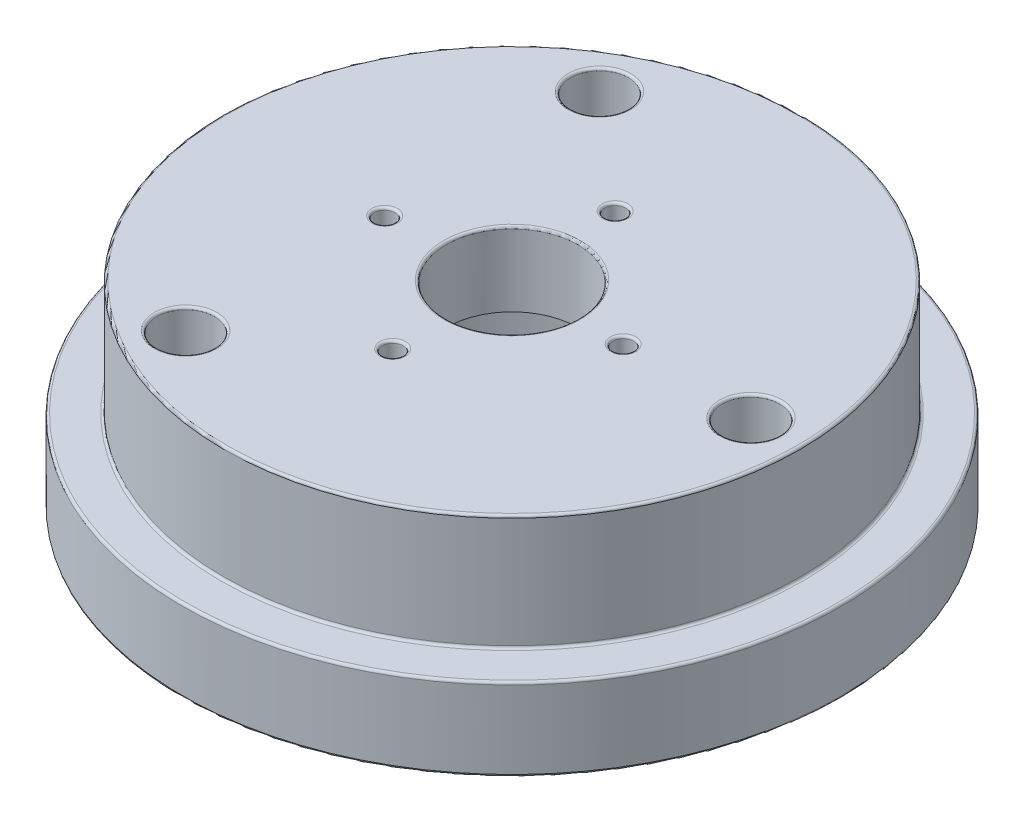
ISO-10303-21;
HEADER;
FILE_DESCRIPTION(('STEP AP214'),'2;1');
FILE_NAME('part.step','',(''),(''),'','','');
FILE_SCHEMA(('AUTOMOTIVE_DESIGN { 1 0 10303 214 1 1 1 1 }'));
ENDSEC;
DATA;
#1=APPLICATION_CONTEXT('core data for automotive mechanical design processes');
#2=APPLICATION_PROTOCOL_DEFINITION('international standard','automotive_design',2000,#1);
#3=PRODUCT_CONTEXT('',#1,'mechanical');
#4=PRODUCT('Part','Part','',(#3));
#5=PRODUCT_RELATED_PRODUCT_CATEGORY('part','',(#4));
#6=PRODUCT_DEFINITION_FORMATION('','',#4);
#7=PRODUCT_DEFINITION_CONTEXT('part definition',#1,'design');
#8=PRODUCT_DEFINITION('design','',#6,#7);
#9=PRODUCT_DEFINITION_SHAPE('','',#8);
#10=(LENGTH_UNIT() NAMED_UNIT(*) SI_UNIT(.MILLI.,.METRE.));
#11=(NAMED_UNIT(*) PLANE_ANGLE_UNIT() SI_UNIT($,.RADIAN.));
#12=(NAMED_UNIT(*) SI_UNIT($,.STERADIAN.) SOLID_ANGLE_UNIT());
#13=UNCERTAINTY_MEASURE_WITH_UNIT(LENGTH_MEASURE(1.E-05),#10,'distance_accuracy_value','');
#14=(GEOMETRIC_REPRESENTATION_CONTEXT(3) GLOBAL_UNCERTAINTY_ASSIGNED_CONTEXT((#13)) GLOBAL_UNIT_ASSIGNED_CONTEXT((#10,
#11,#12)) REPRESENTATION_CONTEXT('',''));
#15=CARTESIAN_POINT('',(0.,0.,0.));
#16=DIRECTION('',(0.,0.,1.));
#17=DIRECTION('',(1.,0.,0.));
#18=AXIS2_PLACEMENT_3D('',#15,#16,#17);
#19=CARTESIAN_POINT('',(-7.24137417898012,12.,0.491374178980117));
#20=DIRECTION('',(0.,-1.,0.));
#21=DIRECTION('',(0.,0.,-1.));
#22=AXIS2_PLACEMENT_3D('',#19,#20,#21);
#23=CYLINDRICAL_SURFACE('',#22,0.625);
#24=CARTESIAN_POINT('',(-7.24137417898012,11.85,0.491374178980117));
#25=DIRECTION('',(0.,1.,0.));
#26=DIRECTION('',(-1.,0.,0.));
#27=AXIS2_PLACEMENT_3D('',#24,#25,#26);
#28=CIRCLE('',#27,0.625);
#29=CARTESIAN_POINT('',(-7.86637417898012,11.85,0.491374178980117));
#30=VERTEX_POINT('',#29);
#31=EDGE_CURVE('E81',#30,#30,#28,.T.);
#32=ORIENTED_EDGE('',*,*,#31,.T.);
#33=EDGE_LOOP('',(#32));
#34=FACE_BOUND('',#33,.T.);
#35=CARTESIAN_POINT('',(-7.24137417898012,7.5,0.491374178980117));
#36=DIRECTION('',(0.,-1.,0.));
#37=DIRECTION('',(0.,0.,-1.));
#38=AXIS2_PLACEMENT_3D('',#35,#36,#37);
#39=CIRCLE('',#38,0.625);
#40=CARTESIAN_POINT('',(-7.24137417898012,7.5,-0.133625821019883));
#41=VERTEX_POINT('',#40);
#42=EDGE_CURVE('E147',#41,#41,#39,.T.);
#43=ORIENTED_EDGE('',*,*,#42,.T.);
#44=EDGE_LOOP('',(#43));
#45=FACE_BOUND('',#44,.T.);
#46=ADVANCED_FACE('F31',(#34,#45),#23,.F.);
#47=CARTESIAN_POINT('',(-0.491374178980117,12.,-6.75));
#48=DIRECTION('',(0.,-1.,0.));
#49=DIRECTION('',(0.,0.,-1.));
#50=AXIS2_PLACEMENT_3D('',#47,#48,#49);
#51=CYLINDRICAL_SURFACE('',#50,0.625);
#52=CARTESIAN_POINT('',(-0.491374178980117,11.85,-6.75));
#53=DIRECTION('',(0.,1.,0.));
#54=DIRECTION('',(-1.,0.,0.));
#55=AXIS2_PLACEMENT_3D('',#52,#53,#54);
#56=CIRCLE('',#55,0.625);
#57=CARTESIAN_POINT('',(-1.11637417898012,11.85,-6.75));
#58=VERTEX_POINT('',#57);
#59=EDGE_CURVE('E78',#58,#58,#56,.T.);
#60=ORIENTED_EDGE('',*,*,#59,.T.);
#61=EDGE_LOOP('',(#60));
#62=FACE_BOUND('',#61,.T.);
#63=CARTESIAN_POINT('',(-0.491374178980117,7.5,-6.75));
#64=DIRECTION('',(0.,-1.,0.));
#65=DIRECTION('',(0.,0.,-1.));
#66=AXIS2_PLACEMENT_3D('',#63,#64,#65);
#67=CIRCLE('',#66,0.625);
#68=CARTESIAN_POINT('',(-0.491374178980117,7.5,-7.375));
#69=VERTEX_POINT('',#68);
#70=EDGE_CURVE('E144',#69,#69,#67,.T.);
#71=ORIENTED_EDGE('',*,*,#70,.T.);
#72=EDGE_LOOP('',(#71));
#73=FACE_BOUND('',#72,.T.);
#74=ADVANCED_FACE('F183',(#62,#73),#51,.F.);
#75=CARTESIAN_POINT('',(0.,12.,0.));
#76=DIRECTION('',(0.,-1.,0.));
#77=DIRECTION('',(0.,0.,-1.));
#78=AXIS2_PLACEMENT_3D('',#75,#76,#77);
#79=CYLINDRICAL_SURFACE('',#78,4.);
#80=CARTESIAN_POINT('',(0.,11.85,0.));
#81=DIRECTION('',(0.,1.,0.));
#82=DIRECTION('',(-1.,0.,0.));
#83=AXIS2_PLACEMENT_3D('',#80,#81,#82);
#84=CIRCLE('',#83,4.);
#85=CARTESIAN_POINT('',(-4.,11.85,0.));
#86=VERTEX_POINT('',#85);
#87=EDGE_CURVE('E69',#86,#86,#84,.T.);
#88=ORIENTED_EDGE('',*,*,#87,.T.);
#89=EDGE_LOOP('',(#88));
#90=FACE_BOUND('',#89,.T.);
#91=CARTESIAN_POINT('',(0.,7.5,0.));
#92=DIRECTION('',(0.,-1.,0.));
#93=DIRECTION('',(0.,0.,-1.));
#94=AXIS2_PLACEMENT_3D('',#91,#92,#93);
#95=CIRCLE('',#94,4.);
#96=CARTESIAN_POINT('',(0.,7.5,-4.));
#97=VERTEX_POINT('',#96);
#98=EDGE_CURVE('E138',#97,#97,#95,.T.);
#99=ORIENTED_EDGE('',*,*,#98,.T.);
#100=EDGE_LOOP('',(#99));
#101=FACE_BOUND('',#100,.T.);
#102=ADVANCED_FACE('F189',(#90,#101),#79,.F.);
#103=CARTESIAN_POINT('',(6.75,12.,0.));
#104=DIRECTION('',(0.,-1.,0.));
#105=DIRECTION('',(0.,0.,-1.));
#106=AXIS2_PLACEMENT_3D('',#103,#104,#105);
#107=CYLINDRICAL_SURFACE('',#106,0.625);
#108=CARTESIAN_POINT('',(6.75,11.85,0.));
#109=DIRECTION('',(0.,1.,0.));
#110=DIRECTION('',(-1.,0.,0.));
#111=AXIS2_PLACEMENT_3D('',#108,#109,#110);
#112=CIRCLE('',#111,0.625);
#113=CARTESIAN_POINT('',(6.125,11.85,0.));
#114=VERTEX_POINT('',#113);
#115=EDGE_CURVE('E60',#114,#114,#112,.T.);
#116=ORIENTED_EDGE('',*,*,#115,.T.);
#117=EDGE_LOOP('',(#116));
#118=FACE_BOUND('',#117,.T.);
#119=CARTESIAN_POINT('',(6.75,7.5,0.));
#120=DIRECTION('',(0.,-1.,0.));
#121=DIRECTION('',(0.,0.,-1.));
#122=AXIS2_PLACEMENT_3D('',#119,#120,#121);
#123=CIRCLE('',#122,0.625);
#124=CARTESIAN_POINT('',(6.75,7.5,-0.625));
#125=VERTEX_POINT('',#124);
#126=EDGE_CURVE('E141',#125,#125,#123,.T.);
#127=ORIENTED_EDGE('',*,*,#126,.T.);
#128=EDGE_LOOP('',(#127));
#129=FACE_BOUND('',#128,.T.);
#130=ADVANCED_FACE('F442',(#118,#129),#107,.F.);
#131=CARTESIAN_POINT('',(0.,12.,7.24137417898012));
#132=DIRECTION('',(0.,-1.,0.));
#133=DIRECTION('',(0.,0.,-1.));
#134=AXIS2_PLACEMENT_3D('',#131,#132,#133);
#135=CYLINDRICAL_SURFACE('',#134,0.625);
#136=CARTESIAN_POINT('',(0.,11.85,7.24137417898012));
#137=DIRECTION('',(0.,1.,0.));
#138=DIRECTION('',(-1.,0.,0.));
#139=AXIS2_PLACEMENT_3D('',#136,#137,#138);
#140=CIRCLE('',#139,0.625);
#141=CARTESIAN_POINT('',(-0.625000000000001,11.85,7.24137417898012));
#142=VERTEX_POINT('',#141);
#143=EDGE_CURVE('E57',#142,#142,#140,.T.);
#144=ORIENTED_EDGE('',*,*,#143,.T.);
#145=EDGE_LOOP('',(#144));
#146=FACE_BOUND('',#145,.T.);
#147=CARTESIAN_POINT('',(0.,7.5,7.24137417898012));
#148=DIRECTION('',(0.,-1.,0.));
#149=DIRECTION('',(0.,0.,-1.));
#150=AXIS2_PLACEMENT_3D('',#147,#148,#149);
#151=CIRCLE('',#150,0.625);
#152=CARTESIAN_POINT('',(0.,7.5,6.61637417898012));
#153=VERTEX_POINT('',#152);
#154=EDGE_CURVE('E150',#153,#153,#151,.T.);
#155=ORIENTED_EDGE('',*,*,#154,.T.);
#156=EDGE_LOOP('',(#155));
#157=FACE_BOUND('',#156,.T.);
#158=ADVANCED_FACE('F154',(#146,#157),#135,.F.);
#159=CARTESIAN_POINT('',(0.,0.,0.));
#160=DIRECTION('',(0.,-1.,0.));
#161=DIRECTION('',(1.,0.,0.));
#162=AXIS2_PLACEMENT_3D('',#159,#160,#161);
#163=PLANE('',#162);
#164=CARTESIAN_POINT('',(0.,0.,0.));
#165=DIRECTION('',(0.,-1.,0.));
#166=DIRECTION('',(1.,0.,0.));
#167=AXIS2_PLACEMENT_3D('',#164,#165,#166);
#168=CIRCLE('',#167,19.85);
#169=CARTESIAN_POINT('',(19.85,0.,0.));
#170=VERTEX_POINT('',#169);
#171=EDGE_CURVE('E38',#170,#170,#168,.T.);
#172=ORIENTED_EDGE('',*,*,#171,.T.);
#173=EDGE_LOOP('',(#172));
#174=FACE_BOUND('',#173,.T.);
#175=CARTESIAN_POINT('',(-7.24999999999988,0.,12.5573683548744));
#176=DIRECTION('',(0.,-1.,0.));
#177=DIRECTION('',(1.,0.,0.));
#178=AXIS2_PLACEMENT_3D('',#175,#176,#177);
#179=CIRCLE('',#178,1.9);
#180=CARTESIAN_POINT('',(-5.34999999999988,0.,12.5573683548744));
#181=VERTEX_POINT('',#180);
#182=EDGE_CURVE('E42',#181,#181,#179,.F.);
#183=ORIENTED_EDGE('',*,*,#182,.T.);
#184=EDGE_LOOP('',(#183));
#185=FACE_BOUND('',#184,.T.);
#186=CARTESIAN_POINT('',(14.5,0.,0.));
#187=DIRECTION('',(0.,-1.,0.));
#188=DIRECTION('',(1.,0.,0.));
#189=AXIS2_PLACEMENT_3D('',#186,#187,#188);
#190=CIRCLE('',#189,1.9);
#191=CARTESIAN_POINT('',(16.4,0.,0.));
#192=VERTEX_POINT('',#191);
#193=EDGE_CURVE('E46',#192,#192,#190,.F.);
#194=ORIENTED_EDGE('',*,*,#193,.T.);
#195=EDGE_LOOP('',(#194));
#196=FACE_BOUND('',#195,.T.);
#197=CARTESIAN_POINT('',(-7.25000000000006,0.,-12.5573683548743));
#198=DIRECTION('',(0.,-1.,0.));
#199=DIRECTION('',(1.,0.,0.));
#200=AXIS2_PLACEMENT_3D('',#197,#198,#199);
#201=CIRCLE('',#200,1.9);
#202=CARTESIAN_POINT('',(-5.35000000000006,0.,-12.5573683548743));
#203=VERTEX_POINT('',#202);
#204=EDGE_CURVE('E51',#203,#203,#201,.F.);
#205=ORIENTED_EDGE('',*,*,#204,.T.);
#206=EDGE_LOOP('',(#205));
#207=FACE_BOUND('',#206,.T.);
#208=CARTESIAN_POINT('',(0.,0.,0.));
#209=DIRECTION('',(0.,-1.,0.));
#210=DIRECTION('',(1.,0.,0.));
#211=AXIS2_PLACEMENT_3D('',#208,#209,#210);
#212=CIRCLE('',#211,10.15);
#213=CARTESIAN_POINT('',(10.15,0.,0.));
#214=VERTEX_POINT('',#213);
#215=EDGE_CURVE('E54',#214,#214,#212,.F.);
#216=ORIENTED_EDGE('',*,*,#215,.T.);
#217=EDGE_LOOP('',(#216));
#218=FACE_BOUND('',#217,.T.);
#219=ADVANCED_FACE('F214',(#174,#185,#196,#207,#218),#163,.T.);
#220=CARTESIAN_POINT('',(0.,12.,0.));
#221=DIRECTION('',(0.,1.,0.));
#222=DIRECTION('',(-1.,0.,0.));
#223=AXIS2_PLACEMENT_3D('',#220,#221,#222);
#224=CYLINDRICAL_SURFACE('',#223,20.);
#225=CARTESIAN_POINT('',(0.,4.85,0.));
#226=DIRECTION('',(0.,1.,0.));
#227=DIRECTION('',(-1.,0.,0.));
#228=AXIS2_PLACEMENT_3D('',#225,#226,#227);
#229=CIRCLE('',#228,20.);
#230=CARTESIAN_POINT('',(-20.,4.85,0.));
#231=VERTEX_POINT('',#230);
#232=EDGE_CURVE('E117',#231,#231,#229,.F.);
#233=ORIENTED_EDGE('',*,*,#232,.T.);
#234=EDGE_LOOP('',(#233));
#235=FACE_BOUND('',#234,.T.);
#236=CARTESIAN_POINT('',(0.,0.149999999999999,0.));
#237=DIRECTION('',(0.,-1.,0.));
#238=DIRECTION('',(1.,0.,0.));
#239=AXIS2_PLACEMENT_3D('',#236,#237,#238);
#240=CIRCLE('',#239,20.);
#241=CARTESIAN_POINT('',(20.,0.149999999999999,0.));
#242=VERTEX_POINT('',#241);
#243=EDGE_CURVE('E120',#242,#242,#240,.F.);
#244=ORIENTED_EDGE('',*,*,#243,.T.);
#245=EDGE_LOOP('',(#244));
#246=FACE_BOUND('',#245,.T.);
#247=ADVANCED_FACE('F210',(#235,#246),#224,.T.);
#248=CARTESIAN_POINT('',(-20.,5.,0.));
#249=DIRECTION('',(0.,1.,0.));
#250=DIRECTION('',(-1.,0.,0.));
#251=AXIS2_PLACEMENT_3D('',#248,#249,#250);
#252=PLANE('',#251);
#253=CARTESIAN_POINT('',(0.,5.,0.));
#254=DIRECTION('',(0.,1.,0.));
#255=DIRECTION('',(-1.,0.,0.));
#256=AXIS2_PLACEMENT_3D('',#253,#254,#255);
#257=CIRCLE('',#256,17.65);
#258=CARTESIAN_POINT('',(-17.65,5.,0.));
#259=VERTEX_POINT('',#258);
#260=EDGE_CURVE('E123',#259,#259,#257,.F.);
#261=ORIENTED_EDGE('',*,*,#260,.T.);
#262=EDGE_LOOP('',(#261));
#263=FACE_BOUND('',#262,.T.);
#264=CARTESIAN_POINT('',(0.,5.,0.));
#265=DIRECTION('',(0.,1.,0.));
#266=DIRECTION('',(-1.,0.,0.));
#267=AXIS2_PLACEMENT_3D('',#264,#265,#266);
#268=CIRCLE('',#267,19.85);
#269=CARTESIAN_POINT('',(-19.85,5.,0.));
#270=VERTEX_POINT('',#269);
#271=EDGE_CURVE('E126',#270,#270,#268,.T.);
#272=ORIENTED_EDGE('',*,*,#271,.T.);
#273=EDGE_LOOP('',(#272));
#274=FACE_BOUND('',#273,.T.);
#275=ADVANCED_FACE('F206',(#263,#274),#252,.T.);
#276=CARTESIAN_POINT('',(0.,12.,0.));
#277=DIRECTION('',(0.,1.,0.));
#278=DIRECTION('',(-1.,0.,0.));
#279=AXIS2_PLACEMENT_3D('',#276,#277,#278);
#280=CYLINDRICAL_SURFACE('',#279,17.5);
#281=CARTESIAN_POINT('',(0.,5.15,0.));
#282=DIRECTION('',(0.,1.,0.));
#283=DIRECTION('',(-1.,0.,0.));
#284=AXIS2_PLACEMENT_3D('',#281,#282,#283);
#285=CIRCLE('',#284,17.5);
#286=CARTESIAN_POINT('',(-17.5,5.15,0.));
#287=VERTEX_POINT('',#286);
#288=EDGE_CURVE('E129',#287,#287,#285,.T.);
#289=ORIENTED_EDGE('',*,*,#288,.T.);
#290=EDGE_LOOP('',(#289));
#291=FACE_BOUND('',#290,.T.);
#292=CARTESIAN_POINT('',(0.,11.85,0.));
#293=DIRECTION('',(0.,1.,0.));
#294=DIRECTION('',(-1.,0.,0.));
#295=AXIS2_PLACEMENT_3D('',#292,#293,#294);
#296=CIRCLE('',#295,17.5);
#297=CARTESIAN_POINT('',(-17.5,11.85,0.));
#298=VERTEX_POINT('',#297);
#299=EDGE_CURVE('E132',#298,#298,#296,.F.);
#300=ORIENTED_EDGE('',*,*,#299,.T.);
#301=EDGE_LOOP('',(#300));
#302=FACE_BOUND('',#301,.T.);
#303=ADVANCED_FACE('F202',(#291,#302),#280,.T.);
#304=CARTESIAN_POINT('',(-17.5,12.,0.));
#305=DIRECTION('',(0.,1.,0.));
#306=DIRECTION('',(-1.,0.,0.));
#307=AXIS2_PLACEMENT_3D('',#304,#305,#306);
#308=PLANE('',#307);
#309=CARTESIAN_POINT('',(0.,12.,0.));
#310=DIRECTION('',(0.,1.,0.));
#311=DIRECTION('',(-1.,0.,0.));
#312=AXIS2_PLACEMENT_3D('',#309,#310,#311);
#313=CIRCLE('',#312,17.35);
#314=CARTESIAN_POINT('',(-17.35,12.,0.));
#315=VERTEX_POINT('',#314);
#316=EDGE_CURVE('E90',#315,#315,#313,.T.);
#317=ORIENTED_EDGE('',*,*,#316,.T.);
#318=EDGE_LOOP('',(#317));
#319=FACE_BOUND('',#318,.T.);
#320=CARTESIAN_POINT('',(-7.24999999999988,12.,12.5573683548744));
#321=DIRECTION('',(0.,1.,0.));
#322=DIRECTION('',(-1.,0.,0.));
#323=AXIS2_PLACEMENT_3D('',#320,#321,#322);
#324=CIRCLE('',#323,1.9);
#325=CARTESIAN_POINT('',(-9.14999999999988,12.,12.5573683548744));
#326=VERTEX_POINT('',#325);
#327=EDGE_CURVE('E93',#326,#326,#324,.F.);
#328=ORIENTED_EDGE('',*,*,#327,.T.);
#329=EDGE_LOOP('',(#328));
#330=FACE_BOUND('',#329,.T.);
#331=CARTESIAN_POINT('',(-7.24137417898012,12.,0.491374178980117));
#332=DIRECTION('',(0.,1.,0.));
#333=DIRECTION('',(-1.,0.,0.));
#334=AXIS2_PLACEMENT_3D('',#331,#332,#333);
#335=CIRCLE('',#334,0.775);
#336=CARTESIAN_POINT('',(-8.01637417898012,12.,0.491374178980117));
#337=VERTEX_POINT('',#336);
#338=EDGE_CURVE('E96',#337,#337,#335,.F.);
#339=ORIENTED_EDGE('',*,*,#338,.T.);
#340=EDGE_LOOP('',(#339));
#341=FACE_BOUND('',#340,.T.);
#342=CARTESIAN_POINT('',(-0.491374178980117,12.,-6.75));
#343=DIRECTION('',(0.,1.,0.));
#344=DIRECTION('',(-1.,0.,0.));
#345=AXIS2_PLACEMENT_3D('',#342,#343,#344);
#346=CIRCLE('',#345,0.775);
#347=CARTESIAN_POINT('',(-1.26637417898012,12.,-6.75));
#348=VERTEX_POINT('',#347);
#349=EDGE_CURVE('E99',#348,#348,#346,.F.);
#350=ORIENTED_EDGE('',*,*,#349,.T.);
#351=EDGE_LOOP('',(#350));
#352=FACE_BOUND('',#351,.T.);
#353=CARTESIAN_POINT('',(14.5,12.,0.));
#354=DIRECTION('',(0.,1.,0.));
#355=DIRECTION('',(-1.,0.,0.));
#356=AXIS2_PLACEMENT_3D('',#353,#354,#355);
#357=CIRCLE('',#356,1.9);
#358=CARTESIAN_POINT('',(12.6,12.,0.));
#359=VERTEX_POINT('',#358);
#360=EDGE_CURVE('E102',#359,#359,#357,.F.);
#361=ORIENTED_EDGE('',*,*,#360,.T.);
#362=EDGE_LOOP('',(#361));
#363=FACE_BOUND('',#362,.T.);
#364=CARTESIAN_POINT('',(0.,12.,0.));
#365=DIRECTION('',(0.,1.,0.));
#366=DIRECTION('',(-1.,0.,0.));
#367=AXIS2_PLACEMENT_3D('',#364,#365,#366);
#368=CIRCLE('',#367,4.15);
#369=CARTESIAN_POINT('',(-4.15,12.,0.));
#370=VERTEX_POINT('',#369);
#371=EDGE_CURVE('E105',#370,#370,#368,.F.);
#372=ORIENTED_EDGE('',*,*,#371,.T.);
#373=EDGE_LOOP('',(#372));
#374=FACE_BOUND('',#373,.T.);
#375=CARTESIAN_POINT('',(-7.25000000000006,12.,-12.5573683548743));
#376=DIRECTION('',(0.,1.,0.));
#377=DIRECTION('',(-1.,0.,0.));
#378=AXIS2_PLACEMENT_3D('',#375,#376,#377);
#379=CIRCLE('',#378,1.9);
#380=CARTESIAN_POINT('',(-9.15000000000006,12.,-12.5573683548743));
#381=VERTEX_POINT('',#380);
#382=EDGE_CURVE('E108',#381,#381,#379,.F.);
#383=ORIENTED_EDGE('',*,*,#382,.T.);
#384=EDGE_LOOP('',(#383));
#385=FACE_BOUND('',#384,.T.);
#386=CARTESIAN_POINT('',(6.75,12.,0.));
#387=DIRECTION('',(0.,1.,0.));
#388=DIRECTION('',(-1.,0.,0.));
#389=AXIS2_PLACEMENT_3D('',#386,#387,#388);
#390=CIRCLE('',#389,0.775);
#391=CARTESIAN_POINT('',(5.975,12.,0.));
#392=VERTEX_POINT('',#391);
#393=EDGE_CURVE('E111',#392,#392,#390,.F.);
#394=ORIENTED_EDGE('',*,*,#393,.T.);
#395=EDGE_LOOP('',(#394));
#396=FACE_BOUND('',#395,.T.);
#397=CARTESIAN_POINT('',(0.,12.,7.24137417898012));
#398=DIRECTION('',(0.,1.,0.));
#399=DIRECTION('',(-1.,0.,0.));
#400=AXIS2_PLACEMENT_3D('',#397,#398,#399);
#401=CIRCLE('',#400,0.775);
#402=CARTESIAN_POINT('',(-0.775000000000001,12.,7.24137417898012));
#403=VERTEX_POINT('',#402);
#404=EDGE_CURVE('E114',#403,#403,#401,.F.);
#405=ORIENTED_EDGE('',*,*,#404,.T.);
#406=EDGE_LOOP('',(#405));
#407=FACE_BOUND('',#406,.T.);
#408=ADVANCED_FACE('F198',(#319,#330,#341,#352,#363,#374,#385,#396,#407),#308,.T.);
#409=CARTESIAN_POINT('',(-7.24999999999988,12.,12.5573683548744));
#410=DIRECTION('',(0.,-1.,0.));
#411=DIRECTION('',(0.,0.,-1.));
#412=AXIS2_PLACEMENT_3D('',#409,#410,#411);
#413=CYLINDRICAL_SURFACE('',#412,1.75);
#414=CARTESIAN_POINT('',(-7.24999999999988,11.85,12.5573683548744));
#415=DIRECTION('',(0.,1.,0.));
#416=DIRECTION('',(-1.,0.,0.));
#417=AXIS2_PLACEMENT_3D('',#414,#415,#416);
#418=CIRCLE('',#417,1.75);
#419=CARTESIAN_POINT('',(-8.99999999999988,11.85,12.5573683548744));
#420=VERTEX_POINT('',#419);
#421=EDGE_CURVE('E84',#420,#420,#418,.T.);
#422=ORIENTED_EDGE('',*,*,#421,.T.);
#423=EDGE_LOOP('',(#422));
#424=FACE_BOUND('',#423,.T.);
#425=CARTESIAN_POINT('',(-7.24999999999988,0.149999999999999,12.5573683548744));
#426=DIRECTION('',(0.,-1.,0.));
#427=DIRECTION('',(1.,0.,0.));
#428=AXIS2_PLACEMENT_3D('',#425,#426,#427);
#429=CIRCLE('',#428,1.75);
#430=CARTESIAN_POINT('',(-5.49999999999988,0.149999999999999,12.5573683548744));
#431=VERTEX_POINT('',#430);
#432=EDGE_CURVE('E87',#431,#431,#429,.T.);
#433=ORIENTED_EDGE('',*,*,#432,.T.);
#434=EDGE_LOOP('',(#433));
#435=FACE_BOUND('',#434,.T.);
#436=ADVANCED_FACE('F195',(#424,#435),#413,.F.);
#437=CARTESIAN_POINT('',(14.5,12.,0.));
#438=DIRECTION('',(0.,-1.,0.));
#439=DIRECTION('',(0.,0.,-1.));
#440=AXIS2_PLACEMENT_3D('',#437,#438,#439);
#441=CYLINDRICAL_SURFACE('',#440,1.75);
#442=CARTESIAN_POINT('',(14.5,11.85,0.));
#443=DIRECTION('',(0.,1.,0.));
#444=DIRECTION('',(-1.,0.,0.));
#445=AXIS2_PLACEMENT_3D('',#442,#443,#444);
#446=CIRCLE('',#445,1.75);
#447=CARTESIAN_POINT('',(12.75,11.85,0.));
#448=VERTEX_POINT('',#447);
#449=EDGE_CURVE('E72',#448,#448,#446,.T.);
#450=ORIENTED_EDGE('',*,*,#449,.T.);
#451=EDGE_LOOP('',(#450));
#452=FACE_BOUND('',#451,.T.);
#453=CARTESIAN_POINT('',(14.5,0.149999999999999,0.));
#454=DIRECTION('',(0.,-1.,0.));
#455=DIRECTION('',(1.,0.,0.));
#456=AXIS2_PLACEMENT_3D('',#453,#454,#455);
#457=CIRCLE('',#456,1.75);
#458=CARTESIAN_POINT('',(16.25,0.149999999999999,0.));
#459=VERTEX_POINT('',#458);
#460=EDGE_CURVE('E75',#459,#459,#457,.T.);
#461=ORIENTED_EDGE('',*,*,#460,.T.);
#462=EDGE_LOOP('',(#461));
#463=FACE_BOUND('',#462,.T.);
#464=ADVANCED_FACE('F178',(#452,#463),#441,.F.);
#465=CARTESIAN_POINT('',(-7.25000000000006,12.,-12.5573683548743));
#466=DIRECTION('',(0.,-1.,0.));
#467=DIRECTION('',(0.,0.,-1.));
#468=AXIS2_PLACEMENT_3D('',#465,#466,#467);
#469=CYLINDRICAL_SURFACE('',#468,1.75);
#470=CARTESIAN_POINT('',(-7.25000000000006,11.85,-12.5573683548743));
#471=DIRECTION('',(0.,1.,0.));
#472=DIRECTION('',(-1.,0.,0.));
#473=AXIS2_PLACEMENT_3D('',#470,#471,#472);
#474=CIRCLE('',#473,1.75);
#475=CARTESIAN_POINT('',(-9.00000000000006,11.85,-12.5573683548743));
#476=VERTEX_POINT('',#475);
#477=EDGE_CURVE('E63',#476,#476,#474,.T.);
#478=ORIENTED_EDGE('',*,*,#477,.T.);
#479=EDGE_LOOP('',(#478));
#480=FACE_BOUND('',#479,.T.);
#481=CARTESIAN_POINT('',(-7.25000000000006,0.149999999999999,-12.5573683548743));
#482=DIRECTION('',(0.,-1.,0.));
#483=DIRECTION('',(1.,0.,0.));
#484=AXIS2_PLACEMENT_3D('',#481,#482,#483);
#485=CIRCLE('',#484,1.75);
#486=CARTESIAN_POINT('',(-5.50000000000006,0.149999999999999,-12.5573683548743));
#487=VERTEX_POINT('',#486);
#488=EDGE_CURVE('E66',#487,#487,#485,.T.);
#489=ORIENTED_EDGE('',*,*,#488,.T.);
#490=EDGE_LOOP('',(#489));
#491=FACE_BOUND('',#490,.T.);
#492=ADVANCED_FACE('F173',(#480,#491),#469,.F.);
#493=CARTESIAN_POINT('',(0.,7.5,0.));
#494=DIRECTION('',(0.,-1.,0.));
#495=DIRECTION('',(0.,0.,-1.));
#496=AXIS2_PLACEMENT_3D('',#493,#494,#495);
#497=CYLINDRICAL_SURFACE('',#496,10.);
#498=CARTESIAN_POINT('',(0.,0.149999999999999,0.));
#499=DIRECTION('',(0.,-1.,0.));
#500=DIRECTION('',(1.,0.,0.));
#501=AXIS2_PLACEMENT_3D('',#498,#499,#500);
#502=CIRCLE('',#501,10.);
#503=CARTESIAN_POINT('',(10.,0.149999999999999,0.));
#504=VERTEX_POINT('',#503);
#505=EDGE_CURVE('E10',#504,#504,#502,.T.);
#506=ORIENTED_EDGE('',*,*,#505,.T.);
#507=EDGE_LOOP('',(#506));
#508=FACE_BOUND('',#507,.T.);
#509=CARTESIAN_POINT('',(0.,7.5,0.));
#510=DIRECTION('',(0.,-1.,0.));
#511=DIRECTION('',(0.,0.,-1.));
#512=AXIS2_PLACEMENT_3D('',#509,#510,#511);
#513=CIRCLE('',#512,10.);
#514=CARTESIAN_POINT('',(0.,7.5,-10.));
#515=VERTEX_POINT('',#514);
#516=EDGE_CURVE('E135',#515,#515,#513,.T.);
#517=ORIENTED_EDGE('',*,*,#516,.F.);
#518=EDGE_LOOP('',(#517));
#519=FACE_BOUND('',#518,.T.);
#520=ADVANCED_FACE('F160',(#508,#519),#497,.F.);
#521=CARTESIAN_POINT('',(0.,7.5,0.));
#522=DIRECTION('',(0.,-1.,0.));
#523=DIRECTION('',(0.,0.,-1.));
#524=AXIS2_PLACEMENT_3D('',#521,#522,#523);
#525=PLANE('',#524);
#526=ORIENTED_EDGE('',*,*,#154,.F.);
#527=EDGE_LOOP('',(#526));
#528=FACE_BOUND('',#527,.T.);
#529=ORIENTED_EDGE('',*,*,#42,.F.);
#530=EDGE_LOOP('',(#529));
#531=FACE_BOUND('',#530,.T.);
#532=ORIENTED_EDGE('',*,*,#70,.F.);
#533=EDGE_LOOP('',(#532));
#534=FACE_BOUND('',#533,.T.);
#535=ORIENTED_EDGE('',*,*,#126,.F.);
#536=EDGE_LOOP('',(#535));
#537=FACE_BOUND('',#536,.T.);
#538=ORIENTED_EDGE('',*,*,#98,.F.);
#539=EDGE_LOOP('',(#538));
#540=FACE_BOUND('',#539,.T.);
#541=ORIENTED_EDGE('',*,*,#516,.T.);
#542=EDGE_LOOP('',(#541));
#543=FACE_BOUND('',#542,.T.);
#544=ADVANCED_FACE('F156',(#528,#531,#534,#537,#540,#543),#525,.T.);
#545=CARTESIAN_POINT('',(0.,5.15,0.));
#546=DIRECTION('',(0.,1.,0.));
#547=DIRECTION('',(-1.,0.,0.));
#548=AXIS2_PLACEMENT_3D('',#545,#546,#547);
#549=TOROIDAL_SURFACE('',#548,17.65,0.15);
#550=ORIENTED_EDGE('',*,*,#260,.F.);
#551=EDGE_LOOP('',(#550));
#552=FACE_BOUND('',#551,.T.);
#553=ORIENTED_EDGE('',*,*,#288,.F.);
#554=EDGE_LOOP('',(#553));
#555=FACE_BOUND('',#554,.T.);
#556=ADVANCED_FACE('F159',(#552,#555),#549,.F.);
#557=CARTESIAN_POINT('',(0.,4.85,0.));
#558=DIRECTION('',(0.,1.,0.));
#559=DIRECTION('',(-1.,0.,0.));
#560=AXIS2_PLACEMENT_3D('',#557,#558,#559);
#561=TOROIDAL_SURFACE('',#560,19.85,0.15);
#562=ORIENTED_EDGE('',*,*,#232,.F.);
#563=EDGE_LOOP('',(#562));
#564=FACE_BOUND('',#563,.T.);
#565=ORIENTED_EDGE('',*,*,#271,.F.);
#566=EDGE_LOOP('',(#565));
#567=FACE_BOUND('',#566,.T.);
#568=ADVANCED_FACE('F220',(#564,#567),#561,.T.);
#569=CARTESIAN_POINT('',(0.,11.85,0.));
#570=DIRECTION('',(0.,1.,0.));
#571=DIRECTION('',(-1.,0.,0.));
#572=AXIS2_PLACEMENT_3D('',#569,#570,#571);
#573=TOROIDAL_SURFACE('',#572,17.35,0.15);
#574=ORIENTED_EDGE('',*,*,#299,.F.);
#575=EDGE_LOOP('',(#574));
#576=FACE_BOUND('',#575,.T.);
#577=ORIENTED_EDGE('',*,*,#316,.F.);
#578=EDGE_LOOP('',(#577));
#579=FACE_BOUND('',#578,.T.);
#580=ADVANCED_FACE('F224',(#576,#579),#573,.T.);
#581=CARTESIAN_POINT('',(-7.24999999999988,11.85,12.5573683548744));
#582=DIRECTION('',(0.,1.,0.));
#583=DIRECTION('',(-1.,0.,0.));
#584=AXIS2_PLACEMENT_3D('',#581,#582,#583);
#585=TOROIDAL_SURFACE('',#584,1.9,0.15);
#586=ORIENTED_EDGE('',*,*,#421,.F.);
#587=EDGE_LOOP('',(#586));
#588=FACE_BOUND('',#587,.T.);
#589=ORIENTED_EDGE('',*,*,#327,.F.);
#590=EDGE_LOOP('',(#589));
#591=FACE_BOUND('',#590,.T.);
#592=ADVANCED_FACE('F228',(#588,#591),#585,.T.);
#593=CARTESIAN_POINT('',(-7.24137417898012,11.85,0.491374178980117));
#594=DIRECTION('',(0.,1.,0.));
#595=DIRECTION('',(-1.,0.,0.));
#596=AXIS2_PLACEMENT_3D('',#593,#594,#595);
#597=TOROIDAL_SURFACE('',#596,0.775,0.15);
#598=ORIENTED_EDGE('',*,*,#31,.F.);
#599=EDGE_LOOP('',(#598));
#600=FACE_BOUND('',#599,.T.);
#601=ORIENTED_EDGE('',*,*,#338,.F.);
#602=EDGE_LOOP('',(#601));
#603=FACE_BOUND('',#602,.T.);
#604=ADVANCED_FACE('F232',(#600,#603),#597,.T.);
#605=CARTESIAN_POINT('',(-0.491374178980117,11.85,-6.75));
#606=DIRECTION('',(0.,1.,0.));
#607=DIRECTION('',(-1.,0.,0.));
#608=AXIS2_PLACEMENT_3D('',#605,#606,#607);
#609=TOROIDAL_SURFACE('',#608,0.775,0.15);
#610=ORIENTED_EDGE('',*,*,#59,.F.);
#611=EDGE_LOOP('',(#610));
#612=FACE_BOUND('',#611,.T.);
#613=ORIENTED_EDGE('',*,*,#349,.F.);
#614=EDGE_LOOP('',(#613));
#615=FACE_BOUND('',#614,.T.);
#616=ADVANCED_FACE('F236',(#612,#615),#609,.T.);
#617=CARTESIAN_POINT('',(14.5,11.85,0.));
#618=DIRECTION('',(0.,1.,0.));
#619=DIRECTION('',(-1.,0.,0.));
#620=AXIS2_PLACEMENT_3D('',#617,#618,#619);
#621=TOROIDAL_SURFACE('',#620,1.9,0.15);
#622=ORIENTED_EDGE('',*,*,#449,.F.);
#623=EDGE_LOOP('',(#622));
#624=FACE_BOUND('',#623,.T.);
#625=ORIENTED_EDGE('',*,*,#360,.F.);
#626=EDGE_LOOP('',(#625));
#627=FACE_BOUND('',#626,.T.);
#628=ADVANCED_FACE('F240',(#624,#627),#621,.T.);
#629=CARTESIAN_POINT('',(0.,11.85,0.));
#630=DIRECTION('',(0.,1.,0.));
#631=DIRECTION('',(-1.,0.,0.));
#632=AXIS2_PLACEMENT_3D('',#629,#630,#631);
#633=TOROIDAL_SURFACE('',#632,4.15,0.15);
#634=ORIENTED_EDGE('',*,*,#87,.F.);
#635=EDGE_LOOP('',(#634));
#636=FACE_BOUND('',#635,.T.);
#637=ORIENTED_EDGE('',*,*,#371,.F.);
#638=EDGE_LOOP('',(#637));
#639=FACE_BOUND('',#638,.T.);
#640=ADVANCED_FACE('F244',(#636,#639),#633,.T.);
#641=CARTESIAN_POINT('',(-7.25000000000006,11.85,-12.5573683548743));
#642=DIRECTION('',(0.,1.,0.));
#643=DIRECTION('',(-1.,0.,0.));
#644=AXIS2_PLACEMENT_3D('',#641,#642,#643);
#645=TOROIDAL_SURFACE('',#644,1.9,0.15);
#646=ORIENTED_EDGE('',*,*,#477,.F.);
#647=EDGE_LOOP('',(#646));
#648=FACE_BOUND('',#647,.T.);
#649=ORIENTED_EDGE('',*,*,#382,.F.);
#650=EDGE_LOOP('',(#649));
#651=FACE_BOUND('',#650,.T.);
#652=ADVANCED_FACE('F248',(#648,#651),#645,.T.);
#653=CARTESIAN_POINT('',(6.75,11.85,0.));
#654=DIRECTION('',(0.,1.,0.));
#655=DIRECTION('',(-1.,0.,0.));
#656=AXIS2_PLACEMENT_3D('',#653,#654,#655);
#657=TOROIDAL_SURFACE('',#656,0.775,0.15);
#658=ORIENTED_EDGE('',*,*,#115,.F.);
#659=EDGE_LOOP('',(#658));
#660=FACE_BOUND('',#659,.T.);
#661=ORIENTED_EDGE('',*,*,#393,.F.);
#662=EDGE_LOOP('',(#661));
#663=FACE_BOUND('',#662,.T.);
#664=ADVANCED_FACE('F252',(#660,#663),#657,.T.);
#665=CARTESIAN_POINT('',(0.,11.85,7.24137417898012));
#666=DIRECTION('',(0.,1.,0.));
#667=DIRECTION('',(-1.,0.,0.));
#668=AXIS2_PLACEMENT_3D('',#665,#666,#667);
#669=TOROIDAL_SURFACE('',#668,0.775,0.15);
#670=ORIENTED_EDGE('',*,*,#143,.F.);
#671=EDGE_LOOP('',(#670));
#672=FACE_BOUND('',#671,.T.);
#673=ORIENTED_EDGE('',*,*,#404,.F.);
#674=EDGE_LOOP('',(#673));
#675=FACE_BOUND('',#674,.T.);
#676=ADVANCED_FACE('F256',(#672,#675),#669,.T.);
#677=CARTESIAN_POINT('',(0.,0.149999999999999,0.));
#678=DIRECTION('',(0.,-1.,0.));
#679=DIRECTION('',(1.,0.,0.));
#680=AXIS2_PLACEMENT_3D('',#677,#678,#679);
#681=TOROIDAL_SURFACE('',#680,19.85,0.15);
#682=ORIENTED_EDGE('',*,*,#171,.F.);
#683=EDGE_LOOP('',(#682));
#684=FACE_BOUND('',#683,.T.);
#685=ORIENTED_EDGE('',*,*,#243,.F.);
#686=EDGE_LOOP('',(#685));
#687=FACE_BOUND('',#686,.T.);
#688=ADVANCED_FACE('F260',(#684,#687),#681,.T.);
#689=CARTESIAN_POINT('',(-7.24999999999988,0.149999999999999,12.5573683548744));
#690=DIRECTION('',(0.,-1.,0.));
#691=DIRECTION('',(1.,0.,0.));
#692=AXIS2_PLACEMENT_3D('',#689,#690,#691);
#693=TOROIDAL_SURFACE('',#692,1.9,0.15);
#694=ORIENTED_EDGE('',*,*,#182,.F.);
#695=EDGE_LOOP('',(#694));
#696=FACE_BOUND('',#695,.T.);
#697=ORIENTED_EDGE('',*,*,#432,.F.);
#698=EDGE_LOOP('',(#697));
#699=FACE_BOUND('',#698,.T.);
#700=ADVANCED_FACE('F264',(#696,#699),#693,.T.);
#701=CARTESIAN_POINT('',(14.5,0.149999999999999,0.));
#702=DIRECTION('',(0.,-1.,0.));
#703=DIRECTION('',(1.,0.,0.));
#704=AXIS2_PLACEMENT_3D('',#701,#702,#703);
#705=TOROIDAL_SURFACE('',#704,1.9,0.15);
#706=ORIENTED_EDGE('',*,*,#193,.F.);
#707=EDGE_LOOP('',(#706));
#708=FACE_BOUND('',#707,.T.);
#709=ORIENTED_EDGE('',*,*,#460,.F.);
#710=EDGE_LOOP('',(#709));
#711=FACE_BOUND('',#710,.T.);
#712=ADVANCED_FACE('F268',(#708,#711),#705,.T.);
#713=CARTESIAN_POINT('',(-7.25000000000006,0.149999999999999,-12.5573683548743));
#714=DIRECTION('',(0.,-1.,0.));
#715=DIRECTION('',(1.,0.,0.));
#716=AXIS2_PLACEMENT_3D('',#713,#714,#715);
#717=TOROIDAL_SURFACE('',#716,1.9,0.15);
#718=ORIENTED_EDGE('',*,*,#204,.F.);
#719=EDGE_LOOP('',(#718));
#720=FACE_BOUND('',#719,.T.);
#721=ORIENTED_EDGE('',*,*,#488,.F.);
#722=EDGE_LOOP('',(#721));
#723=FACE_BOUND('',#722,.T.);
#724=ADVANCED_FACE('F271',(#720,#723),#717,.T.);
#725=CARTESIAN_POINT('',(0.,0.149999999999999,0.));
#726=DIRECTION('',(0.,-1.,0.));
#727=DIRECTION('',(1.,0.,0.));
#728=AXIS2_PLACEMENT_3D('',#725,#726,#727);
#729=TOROIDAL_SURFACE('',#728,10.15,0.15);
#730=ORIENTED_EDGE('',*,*,#215,.F.);
#731=EDGE_LOOP('',(#730));
#732=FACE_BOUND('',#731,.T.);
#733=ORIENTED_EDGE('',*,*,#505,.F.);
#734=EDGE_LOOP('',(#733));
#735=FACE_BOUND('',#734,.T.);
#736=ADVANCED_FACE('F33',(#732,#735),#729,.T.);
#737=CLOSED_SHELL('',(#46,#74,#102,#130,#158,#219,#247,#275,#303,#408,#436,#464,#492,#520,#544,
#556,#568,#580,#592,#604,#616,#628,#640,#652,#664,#676,#688,#700,#712,#724,#736));
#738=MANIFOLD_SOLID_BREP('B2',#737);
#739=ADVANCED_BREP_SHAPE_REPRESENTATION('',(#18,#738),#14);
#740=SHAPE_DEFINITION_REPRESENTATION(#9,#739);
ENDSEC;
END-ISO-10303-21;
